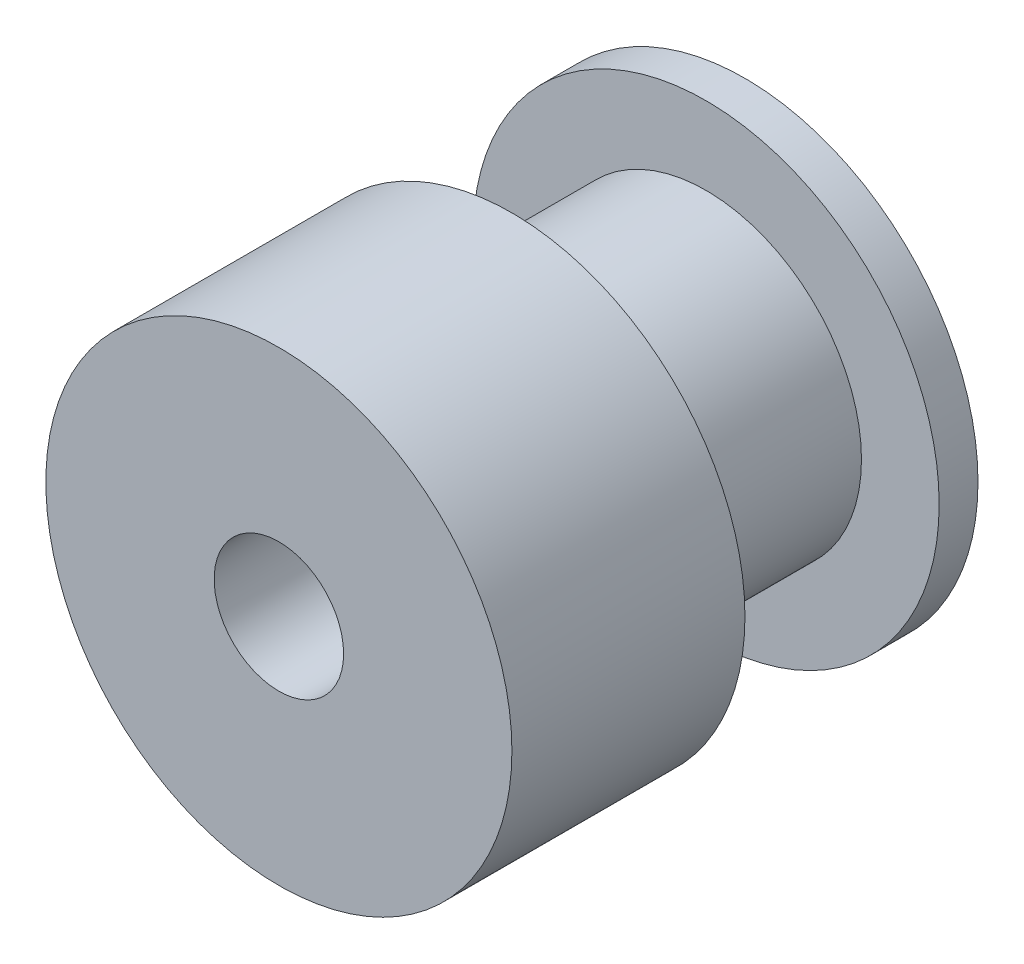
ISO-10303-21;
HEADER;
FILE_DESCRIPTION(('STEP AP214'),'2;1');
FILE_NAME('part.step','',(''),(''),'','','');
FILE_SCHEMA(('AUTOMOTIVE_DESIGN { 1 0 10303 214 1 1 1 1 }'));
ENDSEC;
DATA;
#1=APPLICATION_CONTEXT('core data for automotive mechanical design processes');
#2=APPLICATION_PROTOCOL_DEFINITION('international standard','automotive_design',2000,#1);
#3=PRODUCT_CONTEXT('',#1,'mechanical');
#4=PRODUCT('Part','Part','',(#3));
#5=PRODUCT_RELATED_PRODUCT_CATEGORY('part','',(#4));
#6=PRODUCT_DEFINITION_FORMATION('','',#4);
#7=PRODUCT_DEFINITION_CONTEXT('part definition',#1,'design');
#8=PRODUCT_DEFINITION('design','',#6,#7);
#9=PRODUCT_DEFINITION_SHAPE('','',#8);
#10=(LENGTH_UNIT() NAMED_UNIT(*) SI_UNIT(.MILLI.,.METRE.));
#11=(NAMED_UNIT(*) PLANE_ANGLE_UNIT() SI_UNIT($,.RADIAN.));
#12=(NAMED_UNIT(*) SI_UNIT($,.STERADIAN.) SOLID_ANGLE_UNIT());
#13=UNCERTAINTY_MEASURE_WITH_UNIT(LENGTH_MEASURE(1.E-05),#10,'distance_accuracy_value','');
#14=(GEOMETRIC_REPRESENTATION_CONTEXT(3) GLOBAL_UNCERTAINTY_ASSIGNED_CONTEXT((#13)) GLOBAL_UNIT_ASSIGNED_CONTEXT((#10,
#11,#12)) REPRESENTATION_CONTEXT('',''));
#15=CARTESIAN_POINT('',(0.,0.,0.));
#16=DIRECTION('',(0.,0.,1.));
#17=DIRECTION('',(1.,0.,0.));
#18=AXIS2_PLACEMENT_3D('',#15,#16,#17);
#19=CARTESIAN_POINT('',(0.,0.,18.));
#20=DIRECTION('',(0.,0.,-1.));
#21=DIRECTION('',(-1.,0.,0.));
#22=AXIS2_PLACEMENT_3D('',#19,#20,#21);
#23=CYLINDRICAL_SURFACE('',#22,9.);
#24=CARTESIAN_POINT('',(-9.,0.,14.75));
#25=CARTESIAN_POINT('',(-8.99999894112753,-0.0698524432674793,14.7499970764134));
#26=CARTESIAN_POINT('',(-8.9991782190975,-0.139746876410525,14.7441250072102));
#27=CARTESIAN_POINT('',(-8.99598316286198,-0.277586159937056,14.7207955090503));
#28=CARTESIAN_POINT('',(-8.99360726484073,-0.345528975998051,14.7033264183935));
#29=CARTESIAN_POINT('',(-8.98756916249447,-0.477449936054394,14.6573314803886));
#30=CARTESIAN_POINT('',(-8.98390788118545,-0.541430886330462,14.6288135655305));
#31=CARTESIAN_POINT('',(-8.97570481006727,-0.663688186066636,14.5615489663612));
#32=CARTESIAN_POINT('',(-8.97116315591379,-0.721965412327885,14.5228038576146));
#33=CARTESIAN_POINT('',(-8.96167110812554,-0.831564576835303,14.4359061120719));
#34=CARTESIAN_POINT('',(-8.95671841784775,-0.882842518790509,14.38769823037));
#35=CARTESIAN_POINT('',(-8.94698072235377,-0.976608234008458,14.2833621808506));
#36=CARTESIAN_POINT('',(-8.94219572626413,-1.01909552946634,14.2272335827909));
#37=CARTESIAN_POINT('',(-8.93331280195876,-1.09424186139763,14.1083581044656));
#38=CARTESIAN_POINT('',(-8.92921783911827,-1.12685893577152,14.0455844573968));
#39=CARTESIAN_POINT('',(-8.9222095544648,-1.18107087638651,13.9153837950484));
#40=CARTESIAN_POINT('',(-8.91929617746777,-1.20266625739016,13.8479569972589));
#41=CARTESIAN_POINT('',(-8.91500325152303,-1.23408646989723,13.7108241341288));
#42=CARTESIAN_POINT('',(-8.91361394942638,-1.24398617833557,13.6411355355509));
#43=CARTESIAN_POINT('',(-8.91249677033616,-1.25196586814035,13.5010734013625));
#44=CARTESIAN_POINT('',(-8.91276881133565,-1.25004643292126,13.4306998997312));
#45=CARTESIAN_POINT('',(-8.91493465758728,-1.23450363802965,13.2917912089734));
#46=CARTESIAN_POINT('',(-8.91681696642588,-1.22096324330852,13.2232465318094));
#47=CARTESIAN_POINT('',(-8.92197331658116,-1.18269256535987,13.0894116656842));
#48=CARTESIAN_POINT('',(-8.92524739209301,-1.15796200719349,13.0241215567304));
#49=CARTESIAN_POINT('',(-8.93283122971518,-1.09792538280569,12.8983942713472));
#50=CARTESIAN_POINT('',(-8.93714446505613,-1.0625837510599,12.8379742960476));
#51=CARTESIAN_POINT('',(-8.94631804418279,-0.982353578958003,12.723891038365));
#52=CARTESIAN_POINT('',(-8.95117841880647,-0.937464500359761,12.6702281371873));
#53=CARTESIAN_POINT('',(-8.96094958209836,-0.838956215124414,12.570701144593));
#54=CARTESIAN_POINT('',(-8.96586044627415,-0.785265592189274,12.5249077163315));
#55=CARTESIAN_POINT('',(-8.97514050674014,-0.670922859167218,12.4429714225639));
#56=CARTESIAN_POINT('',(-8.97950970122931,-0.610270725934937,12.4068285891451));
#57=CARTESIAN_POINT('',(-8.98721779212188,-0.48366856673251,12.3452174912496));
#58=CARTESIAN_POINT('',(-8.99055620841331,-0.417716089958269,12.3197541990764));
#59=CARTESIAN_POINT('',(-8.99582244302654,-0.282414617975524,12.280283927917));
#60=CARTESIAN_POINT('',(-8.99775034299602,-0.213065819610928,12.2662762858154));
#61=CARTESIAN_POINT('',(-8.99996760516493,-0.0735506507378779,12.2502077928597));
#62=CARTESIAN_POINT('',(-9.00027030327137,-0.00339568328216565,12.2480497048746));
#63=CARTESIAN_POINT('',(-8.99923922007978,0.136275022554033,12.2554841765477));
#64=CARTESIAN_POINT('',(-8.99790548202965,0.205790777778776,12.2650764256667));
#65=CARTESIAN_POINT('',(-8.99375965195284,0.341918779308823,12.2956584556032));
#66=CARTESIAN_POINT('',(-8.99095364519698,0.408541763946739,12.3166013329707));
#67=CARTESIAN_POINT('',(-8.98417711217329,0.537330456139149,12.3692409923423));
#68=CARTESIAN_POINT('',(-8.98020653811878,0.599495980656597,12.4009382156469));
#69=CARTESIAN_POINT('',(-8.97150954082181,0.718035810499835,12.4744182445134));
#70=CARTESIAN_POINT('',(-8.96677851553782,0.774371184438115,12.516263300766));
#71=CARTESIAN_POINT('',(-8.95710284930005,0.879254172769037,12.6087638519514));
#72=CARTESIAN_POINT('',(-8.95215819779384,0.927801401893363,12.6594197824873));
#73=CARTESIAN_POINT('',(-8.94257081023238,1.0160797430412,12.7685349467284));
#74=CARTESIAN_POINT('',(-8.93793045954481,1.05574600476852,12.8270468876433));
#75=CARTESIAN_POINT('',(-8.92951793446703,1.12468695508694,12.9499600185109));
#76=CARTESIAN_POINT('',(-8.92574573934466,1.15396189183909,13.0143610677763));
#77=CARTESIAN_POINT('',(-8.91951345452543,1.20118657145917,13.1470235457848));
#78=CARTESIAN_POINT('',(-8.91704928346967,1.2191715741733,13.2152722227998));
#79=CARTESIAN_POINT('',(-8.91370081228885,1.24341873550693,13.3538577657775));
#80=CARTESIAN_POINT('',(-8.91281641984846,1.24968157911898,13.4241945094785));
#81=CARTESIAN_POINT('',(-8.91273074448821,1.25029208082021,13.5643138114601));
#82=CARTESIAN_POINT('',(-8.91351506465158,1.2447416584131,13.6340959385059));
#83=CARTESIAN_POINT('',(-8.91664731052215,1.22210038835409,13.7717246084148));
#84=CARTESIAN_POINT('',(-8.91899523506782,1.20500954927507,13.8395711527156));
#85=CARTESIAN_POINT('',(-8.92498537468198,1.15980672337383,13.9713813721868));
#86=CARTESIAN_POINT('',(-8.92862687318732,1.13170083734511,14.0353471741365));
#87=CARTESIAN_POINT('',(-8.93679486162302,1.06527577701554,14.1576715834595));
#88=CARTESIAN_POINT('',(-8.94132137280736,1.02695635742407,14.2160300561201));
#89=CARTESIAN_POINT('',(-8.95079601194598,0.94081790057283,14.3260026282592));
#90=CARTESIAN_POINT('',(-8.9557473092005,0.892923123926596,14.3775571357939));
#91=CARTESIAN_POINT('',(-8.9654864535163,0.789153098909232,14.4719345729145));
#92=CARTESIAN_POINT('',(-8.97027426208699,0.733275987068046,14.5147554579602));
#93=CARTESIAN_POINT('',(-8.97917230387635,0.614821941865005,14.5906262405455));
#94=CARTESIAN_POINT('',(-8.98327925254998,0.552214803422004,14.6236293504997));
#95=CARTESIAN_POINT('',(-8.99032025416553,0.422321399113689,14.6786041751453));
#96=CARTESIAN_POINT('',(-8.99325554918744,0.355040177626123,14.7005875782822));
#97=CARTESIAN_POINT('',(-8.99693485713489,0.239529012760908,14.727782701193));
#98=CARTESIAN_POINT('',(-8.99807852526027,0.192019668179786,14.7361018139969));
#99=CARTESIAN_POINT('',(-8.9996114581541,0.0963468711203362,14.7472114443363));
#100=CARTESIAN_POINT('',(-9.00000073039825,0.0481834251286111,14.7500020166569));
#101=CARTESIAN_POINT('',(-9.,0.,14.75));
#102=B_SPLINE_CURVE_WITH_KNOTS('',3,(#24,#25,#26,#27,#28,#29,#30,#31,#32,#33,#34,#35,#36,#37,
#38,#39,#40,#41,#42,#43,#44,#45,#46,#47,#48,#49,#50,#51,#52,#53,#54,#55,#56,#57,#58,#59,#60,#61,
#62,#63,#64,#65,#66,#67,#68,#69,#70,#71,#72,#73,#74,#75,#76,#77,#78,#79,#80,#81,#82,#83,#84,#85,
#86,#87,#88,#89,#90,#91,#92,#93,#94,#95,#96,#97,#98,#99,#100,#101),.UNSPECIFIED.,.T.,.F.,(4,2,2,
2,2,2,2,2,2,2,2,2,2,2,2,2,2,2,2,2,2,2,2,2,2,2,2,2,2,2,2,2,2,2,2,2,2,2,4),(0.,0.209381295059176,
0.418973458745449,0.628415424004149,0.83782514220054,1.0484958752077,1.25917805595891,
1.47074373528117,1.68229953263234,1.89249345858177,2.10267700905927,2.31137237127791,
2.52007286135607,2.72948082119297,2.93890058963983,3.15011234914945,3.36132481090823,
3.57263550251899,3.78393396145113,3.99349589004417,4.20305228043053,4.41174926456981,
4.62045481354833,4.83047455215844,5.04050467694124,5.25202178604051,5.46353384344125,
5.67438199262967,5.8852178203746,6.09424202940506,6.30326608316047,6.51217453009901,
6.72108799468396,6.93172442182197,7.14241010247462,7.35408430824961,7.5655335166086,
7.70996379646391,7.85439264507531),.UNSPECIFIED.);
#103=CARTESIAN_POINT('',(-9.,0.,14.75));
#104=VERTEX_POINT('',#103);
#105=EDGE_CURVE('E65',#104,#104,#102,.T.);
#106=ORIENTED_EDGE('',*,*,#105,.T.);
#107=EDGE_LOOP('',(#106));
#108=FACE_BOUND('',#107,.T.);
#109=CARTESIAN_POINT('',(0.,-9.,14.75));
#110=CARTESIAN_POINT('',(0.0698524432674794,-8.99999894112753,14.7499970764134));
#111=CARTESIAN_POINT('',(0.139746876410526,-8.9991782190975,14.7441250072102));
#112=CARTESIAN_POINT('',(0.277586159937057,-8.99598316286198,14.7207955090503));
#113=CARTESIAN_POINT('',(0.345528975998052,-8.99360726484073,14.7033264183935));
#114=CARTESIAN_POINT('',(0.477449936054396,-8.98756916249447,14.6573314803886));
#115=CARTESIAN_POINT('',(0.541430886330464,-8.98390788118545,14.6288135655306));
#116=CARTESIAN_POINT('',(0.66368818606664,-8.97570481006727,14.5615489663612));
#117=CARTESIAN_POINT('',(0.721965412327891,-8.97116315591379,14.5228038576146));
#118=CARTESIAN_POINT('',(0.831564576835312,-8.96167110812553,14.435906112072));
#119=CARTESIAN_POINT('',(0.88284251879052,-8.95671841784775,14.3876982303701));
#120=CARTESIAN_POINT('',(0.976608234008471,-8.94698072235377,14.2833621808506));
#121=CARTESIAN_POINT('',(1.01909552946636,-8.94219572626413,14.227233582791));
#122=CARTESIAN_POINT('',(1.09424186139764,-8.93331280195876,14.1083581044657));
#123=CARTESIAN_POINT('',(1.12685893577153,-8.92921783911827,14.0455844573968));
#124=CARTESIAN_POINT('',(1.18107087638653,-8.9222095544648,13.9153837950484));
#125=CARTESIAN_POINT('',(1.20266625739018,-8.91929617746777,13.847956997259));
#126=CARTESIAN_POINT('',(1.23408646989725,-8.91500325152303,13.7108241341288));
#127=CARTESIAN_POINT('',(1.24398617833559,-8.91361394942638,13.641135535551));
#128=CARTESIAN_POINT('',(1.25196586814038,-8.91249677033615,13.5010734013625));
#129=CARTESIAN_POINT('',(1.25004643292129,-8.91276881133565,13.4306998997312));
#130=CARTESIAN_POINT('',(1.23450363802969,-8.91493465758728,13.2917912089735));
#131=CARTESIAN_POINT('',(1.22096324330855,-8.91681696642587,13.2232465318095));
#132=CARTESIAN_POINT('',(1.18269256535992,-8.92197331658116,13.0894116656842));
#133=CARTESIAN_POINT('',(1.15796200719353,-8.92524739209301,13.0241215567304));
#134=CARTESIAN_POINT('',(1.09792538280573,-8.93283122971518,12.8983942713472));
#135=CARTESIAN_POINT('',(1.06258375105995,-8.93714446505613,12.8379742960476));
#136=CARTESIAN_POINT('',(0.982353578958055,-8.94631804418278,12.7238910383651));
#137=CARTESIAN_POINT('',(0.937464500359815,-8.95117841880646,12.6702281371873));
#138=CARTESIAN_POINT('',(0.83895621512447,-8.96094958209835,12.570701144593));
#139=CARTESIAN_POINT('',(0.785265592189331,-8.96586044627415,12.5249077163315));
#140=CARTESIAN_POINT('',(0.670922859167277,-8.97514050674014,12.4429714225639));
#141=CARTESIAN_POINT('',(0.610270725934997,-8.97950970122931,12.4068285891452));
#142=CARTESIAN_POINT('',(0.483668566732571,-8.98721779212188,12.3452174912496));
#143=CARTESIAN_POINT('',(0.417716089958331,-8.99055620841331,12.3197541990765));
#144=CARTESIAN_POINT('',(0.282414617975588,-8.99582244302653,12.280283927917));
#145=CARTESIAN_POINT('',(0.213065819610992,-8.99775034299601,12.2662762858154));
#146=CARTESIAN_POINT('',(0.0735506507379419,-8.99996760516492,12.2502077928597));
#147=CARTESIAN_POINT('',(0.00339568328222966,-9.00027030327137,12.2480497048746));
#148=CARTESIAN_POINT('',(-0.13627502255397,-8.99923922007978,12.2554841765477));
#149=CARTESIAN_POINT('',(-0.205790777778713,-8.99790548202965,12.2650764256667));
#150=CARTESIAN_POINT('',(-0.341918779308761,-8.99375965195284,12.2956584556032));
#151=CARTESIAN_POINT('',(-0.408541763946677,-8.99095364519698,12.3166013329707));
#152=CARTESIAN_POINT('',(-0.537330456139089,-8.9841771121733,12.3692409923423));
#153=CARTESIAN_POINT('',(-0.599495980656538,-8.98020653811879,12.4009382156469));
#154=CARTESIAN_POINT('',(-0.718035810499777,-8.97150954082181,12.4744182445134));
#155=CARTESIAN_POINT('',(-0.774371184438058,-8.96677851553782,12.516263300766));
#156=CARTESIAN_POINT('',(-0.879254172768982,-8.95710284930006,12.6087638519514));
#157=CARTESIAN_POINT('',(-0.927801401893309,-8.95215819779385,12.6594197824873));
#158=CARTESIAN_POINT('',(-1.01607974304115,-8.94257081023239,12.7685349467284));
#159=CARTESIAN_POINT('',(-1.05574600476847,-8.93793045954482,12.8270468876433));
#160=CARTESIAN_POINT('',(-1.12468695508689,-8.92951793446703,12.9499600185109));
#161=CARTESIAN_POINT('',(-1.15396189183904,-8.92574573934466,13.0143610677762));
#162=CARTESIAN_POINT('',(-1.20118657145913,-8.91951345452543,13.1470235457847));
#163=CARTESIAN_POINT('',(-1.21917157417326,-8.91704928346968,13.2152722227997));
#164=CARTESIAN_POINT('',(-1.24341873550689,-8.91370081228886,13.3538577657774));
#165=CARTESIAN_POINT('',(-1.24968157911894,-8.91281641984846,13.4241945094785));
#166=CARTESIAN_POINT('',(-1.25029208082018,-8.91273074448822,13.56431381146));
#167=CARTESIAN_POINT('',(-1.24474165841307,-8.91351506465158,13.6340959385059));
#168=CARTESIAN_POINT('',(-1.22210038835406,-8.91664731052215,13.7717246084147));
#169=CARTESIAN_POINT('',(-1.20500954927505,-8.91899523506783,13.8395711527156));
#170=CARTESIAN_POINT('',(-1.15980672337381,-8.92498537468198,13.9713813721868));
#171=CARTESIAN_POINT('',(-1.13170083734509,-8.92862687318733,14.0353471741365));
#172=CARTESIAN_POINT('',(-1.06527577701553,-8.93679486162302,14.1576715834595));
#173=CARTESIAN_POINT('',(-1.02695635742406,-8.94132137280736,14.21603005612));
#174=CARTESIAN_POINT('',(-0.94081790057282,-8.95079601194598,14.3260026282592));
#175=CARTESIAN_POINT('',(-0.892923123926587,-8.9557473092005,14.3775571357939));
#176=CARTESIAN_POINT('',(-0.789153098909225,-8.9654864535163,14.4719345729145));
#177=CARTESIAN_POINT('',(-0.733275987068041,-8.97027426208699,14.5147554579602));
#178=CARTESIAN_POINT('',(-0.614821941865002,-8.97917230387635,14.5906262405455));
#179=CARTESIAN_POINT('',(-0.552214803422002,-8.98327925254998,14.6236293504997));
#180=CARTESIAN_POINT('',(-0.422321399113688,-8.99032025416553,14.6786041751453));
#181=CARTESIAN_POINT('',(-0.355040177626122,-8.99325554918744,14.7005875782822));
#182=CARTESIAN_POINT('',(-0.239529012760908,-8.99693485713489,14.727782701193));
#183=CARTESIAN_POINT('',(-0.192019668179786,-8.99807852526027,14.7361018139969));
#184=CARTESIAN_POINT('',(-0.0963468711203365,-8.9996114581541,14.7472114443363));
#185=CARTESIAN_POINT('',(-0.0481834251286112,-9.00000073039825,14.7500020166569));
#186=CARTESIAN_POINT('',(0.,-9.,14.75));
#187=B_SPLINE_CURVE_WITH_KNOTS('',3,(#109,#110,#111,#112,#113,#114,#115,#116,#117,#118,#119,
#120,#121,#122,#123,#124,#125,#126,#127,#128,#129,#130,#131,#132,#133,#134,#135,#136,#137,#138,
#139,#140,#141,#142,#143,#144,#145,#146,#147,#148,#149,#150,#151,#152,#153,#154,#155,#156,#157,
#158,#159,#160,#161,#162,#163,#164,#165,#166,#167,#168,#169,#170,#171,#172,#173,#174,#175,#176,
#177,#178,#179,#180,#181,#182,#183,#184,#185,#186),.UNSPECIFIED.,.T.,.F.,(4,2,2,2,2,2,2,2,2,2,2,
2,2,2,2,2,2,2,2,2,2,2,2,2,2,2,2,2,2,2,2,2,2,2,2,2,2,2,4),(0.,0.209381295059176,
0.418973458745448,0.628415424004147,0.83782514220054,1.0484958752077,1.25917805595891,
1.47074373528117,1.68229953263234,1.89249345858177,2.10267700905927,2.31137237127791,
2.52007286135607,2.72948082119297,2.93890058963983,3.15011234914945,3.36132481090823,
3.57263550251899,3.78393396145114,3.99349589004417,4.20305228043053,4.41174926456981,
4.62045481354833,4.83047455215844,5.04050467694123,5.25202178604051,5.46353384344125,
5.67438199262967,5.88521782037459,6.09424202940506,6.30326608316047,6.51217453009901,
6.72108799468396,6.93172442182198,7.14241010247462,7.35408430824961,7.5655335166086,
7.70996379646391,7.85439264507531),.UNSPECIFIED.);
#188=CARTESIAN_POINT('',(0.,-9.,14.75));
#189=VERTEX_POINT('',#188);
#190=EDGE_CURVE('E64',#189,#189,#187,.T.);
#191=ORIENTED_EDGE('',*,*,#190,.T.);
#192=EDGE_LOOP('',(#191));
#193=FACE_BOUND('',#192,.T.);
#194=CARTESIAN_POINT('',(0.,0.,9.));
#195=DIRECTION('',(0.,0.,1.));
#196=DIRECTION('',(1.,0.,0.));
#197=AXIS2_PLACEMENT_3D('',#194,#195,#196);
#198=CIRCLE('',#197,9.);
#199=CARTESIAN_POINT('',(9.,0.,9.));
#200=VERTEX_POINT('',#199);
#201=EDGE_CURVE('E53',#200,#200,#198,.T.);
#202=ORIENTED_EDGE('',*,*,#201,.T.);
#203=EDGE_LOOP('',(#202));
#204=FACE_BOUND('',#203,.T.);
#205=CARTESIAN_POINT('',(0.,0.,18.));
#206=DIRECTION('',(0.,0.,1.));
#207=DIRECTION('',(1.,0.,0.));
#208=AXIS2_PLACEMENT_3D('',#205,#206,#207);
#209=CIRCLE('',#208,9.);
#210=CARTESIAN_POINT('',(9.,0.,18.));
#211=VERTEX_POINT('',#210);
#212=EDGE_CURVE('E10',#211,#211,#209,.T.);
#213=ORIENTED_EDGE('',*,*,#212,.F.);
#214=EDGE_LOOP('',(#213));
#215=FACE_BOUND('',#214,.T.);
#216=ADVANCED_FACE('F35',(#108,#193,#204,#215),#23,.T.);
#217=CARTESIAN_POINT('',(0.,0.,18.));
#218=DIRECTION('',(0.,0.,1.));
#219=DIRECTION('',(1.,0.,0.));
#220=AXIS2_PLACEMENT_3D('',#217,#218,#219);
#221=PLANE('',#220);
#222=CARTESIAN_POINT('',(0.,0.,18.));
#223=DIRECTION('',(0.,0.,1.));
#224=DIRECTION('',(1.,0.,0.));
#225=AXIS2_PLACEMENT_3D('',#222,#223,#224);
#226=CIRCLE('',#225,2.5);
#227=CARTESIAN_POINT('',(2.5,0.,18.));
#228=VERTEX_POINT('',#227);
#229=EDGE_CURVE('E87',#228,#228,#226,.T.);
#230=ORIENTED_EDGE('',*,*,#229,.F.);
#231=EDGE_LOOP('',(#230));
#232=FACE_BOUND('',#231,.T.);
#233=ORIENTED_EDGE('',*,*,#212,.T.);
#234=EDGE_LOOP('',(#233));
#235=FACE_BOUND('',#234,.T.);
#236=ADVANCED_FACE('F118',(#232,#235),#221,.T.);
#237=CARTESIAN_POINT('',(0.,0.,9.));
#238=DIRECTION('',(0.,0.,1.));
#239=DIRECTION('',(1.,0.,0.));
#240=AXIS2_PLACEMENT_3D('',#237,#238,#239);
#241=PLANE('',#240);
#242=ORIENTED_EDGE('',*,*,#201,.F.);
#243=EDGE_LOOP('',(#242));
#244=FACE_BOUND('',#243,.T.);
#245=CARTESIAN_POINT('',(0.,0.,9.));
#246=DIRECTION('',(0.,0.,1.));
#247=DIRECTION('',(1.,0.,0.));
#248=AXIS2_PLACEMENT_3D('',#245,#246,#247);
#249=CIRCLE('',#248,6.);
#250=CARTESIAN_POINT('',(6.,0.,9.));
#251=VERTEX_POINT('',#250);
#252=EDGE_CURVE('E93',#251,#251,#249,.T.);
#253=ORIENTED_EDGE('',*,*,#252,.T.);
#254=EDGE_LOOP('',(#253));
#255=FACE_BOUND('',#254,.T.);
#256=ADVANCED_FACE('F123',(#244,#255),#241,.F.);
#257=CARTESIAN_POINT('',(0.,0.,1.5));
#258=DIRECTION('',(0.,0.,1.));
#259=DIRECTION('',(1.,0.,0.));
#260=AXIS2_PLACEMENT_3D('',#257,#258,#259);
#261=PLANE('',#260);
#262=CARTESIAN_POINT('',(0.,0.,1.5));
#263=DIRECTION('',(0.,0.,1.));
#264=DIRECTION('',(1.,0.,0.));
#265=AXIS2_PLACEMENT_3D('',#262,#263,#264);
#266=CIRCLE('',#265,9.);
#267=CARTESIAN_POINT('',(9.,0.,1.5));
#268=VERTEX_POINT('',#267);
#269=EDGE_CURVE('E56',#268,#268,#266,.T.);
#270=ORIENTED_EDGE('',*,*,#269,.T.);
#271=EDGE_LOOP('',(#270));
#272=FACE_BOUND('',#271,.T.);
#273=CARTESIAN_POINT('',(0.,0.,1.5));
#274=DIRECTION('',(0.,0.,1.));
#275=DIRECTION('',(1.,0.,0.));
#276=AXIS2_PLACEMENT_3D('',#273,#274,#275);
#277=CIRCLE('',#276,6.);
#278=CARTESIAN_POINT('',(6.,0.,1.5));
#279=VERTEX_POINT('',#278);
#280=EDGE_CURVE('E90',#279,#279,#277,.T.);
#281=ORIENTED_EDGE('',*,*,#280,.F.);
#282=EDGE_LOOP('',(#281));
#283=FACE_BOUND('',#282,.T.);
#284=ADVANCED_FACE('F103',(#272,#283),#261,.T.);
#285=CARTESIAN_POINT('',(0.,0.,9.));
#286=DIRECTION('',(0.,0.,-1.));
#287=DIRECTION('',(-1.,0.,0.));
#288=AXIS2_PLACEMENT_3D('',#285,#286,#287);
#289=CYLINDRICAL_SURFACE('',#288,6.);
#290=ORIENTED_EDGE('',*,*,#252,.F.);
#291=EDGE_LOOP('',(#290));
#292=FACE_BOUND('',#291,.T.);
#293=ORIENTED_EDGE('',*,*,#280,.T.);
#294=EDGE_LOOP('',(#293));
#295=FACE_BOUND('',#294,.T.);
#296=ADVANCED_FACE('F115',(#292,#295),#289,.T.);
#297=CARTESIAN_POINT('',(0.,0.,0.));
#298=DIRECTION('',(0.,0.,1.));
#299=DIRECTION('',(1.,0.,0.));
#300=AXIS2_PLACEMENT_3D('',#297,#298,#299);
#301=PLANE('',#300);
#302=CARTESIAN_POINT('',(0.,0.,0.));
#303=DIRECTION('',(0.,0.,1.));
#304=DIRECTION('',(1.,0.,0.));
#305=AXIS2_PLACEMENT_3D('',#302,#303,#304);
#306=CIRCLE('',#305,2.5);
#307=CARTESIAN_POINT('',(2.5,0.,0.));
#308=VERTEX_POINT('',#307);
#309=EDGE_CURVE('E83',#308,#308,#306,.T.);
#310=ORIENTED_EDGE('',*,*,#309,.T.);
#311=EDGE_LOOP('',(#310));
#312=FACE_BOUND('',#311,.T.);
#313=CARTESIAN_POINT('',(0.,0.,0.));
#314=DIRECTION('',(0.,0.,1.));
#315=DIRECTION('',(1.,0.,0.));
#316=AXIS2_PLACEMENT_3D('',#313,#314,#315);
#317=CIRCLE('',#316,9.);
#318=CARTESIAN_POINT('',(9.,0.,0.));
#319=VERTEX_POINT('',#318);
#320=EDGE_CURVE('E48',#319,#319,#317,.T.);
#321=ORIENTED_EDGE('',*,*,#320,.F.);
#322=EDGE_LOOP('',(#321));
#323=FACE_BOUND('',#322,.T.);
#324=ADVANCED_FACE('F108',(#312,#323),#301,.F.);
#325=ORIENTED_EDGE('',*,*,#320,.T.);
#326=EDGE_LOOP('',(#325));
#327=FACE_BOUND('',#326,.T.);
#328=ORIENTED_EDGE('',*,*,#269,.F.);
#329=EDGE_LOOP('',(#328));
#330=FACE_BOUND('',#329,.T.);
#331=ADVANCED_FACE('F106',(#327,#330),#23,.T.);
#332=CARTESIAN_POINT('',(0.,0.,18.));
#333=DIRECTION('',(0.,0.,-1.));
#334=DIRECTION('',(-1.,0.,0.));
#335=AXIS2_PLACEMENT_3D('',#332,#333,#334);
#336=CYLINDRICAL_SURFACE('',#335,2.5);
#337=CARTESIAN_POINT('',(-2.5,0.,14.75));
#338=CARTESIAN_POINT('',(-2.49999641755189,-0.0657149536912332,14.7499958721006));
#339=CARTESIAN_POINT('',(-2.49738113774397,-0.131508249622541,14.7447874085979));
#340=CARTESIAN_POINT('',(-2.48717695046745,-0.261150294085532,14.7241838995739));
#341=CARTESIAN_POINT('',(-2.47957859786229,-0.32499510839188,14.7087695087529));
#342=CARTESIAN_POINT('',(-2.46020349254139,-0.448666931100718,14.668507739229));
#343=CARTESIAN_POINT('',(-2.448442989719,-0.508508503673975,14.64369701969));
#344=CARTESIAN_POINT('',(-2.42182220644723,-0.623090771008206,14.5855367232938));
#345=CARTESIAN_POINT('',(-2.40696217041913,-0.677831867487562,14.5521878196889));
#346=CARTESIAN_POINT('',(-2.37445322822571,-0.784384772202399,14.4756034381434));
#347=CARTESIAN_POINT('',(-2.3566899890942,-0.83581901390264,14.4318919009504));
#348=CARTESIAN_POINT('',(-2.3207496280843,-0.930974306083721,14.3368481509412));
#349=CARTESIAN_POINT('',(-2.30257220261294,-0.974689478883457,14.2855101852844));
#350=CARTESIAN_POINT('',(-2.26623688996684,-1.05656500056285,14.1718958130958));
#351=CARTESIAN_POINT('',(-2.24818983712665,-1.09403166943955,14.1090798770676));
#352=CARTESIAN_POINT('',(-2.21607473465401,-1.15771028361337,13.9770408300172));
#353=CARTESIAN_POINT('',(-2.20200384508737,-1.18393026870791,13.9078223390966));
#354=CARTESIAN_POINT('',(-2.18072333797261,-1.22266555273573,13.7691686182226));
#355=CARTESIAN_POINT('',(-2.17315339479642,-1.23590732135055,13.6999944349157));
#356=CARTESIAN_POINT('',(-2.1647736243566,-1.25053374163605,13.5600264527756));
#357=CARTESIAN_POINT('',(-2.1639571167911,-1.25193011046634,13.489234323911));
#358=CARTESIAN_POINT('',(-2.16888662821561,-1.24335910896536,13.3571424696058));
#359=CARTESIAN_POINT('',(-2.17385954577517,-1.23473069942102,13.2957199609712));
#360=CARTESIAN_POINT('',(-2.18845285917313,-1.20867481132116,13.1753476132837));
#361=CARTESIAN_POINT('',(-2.19807473539721,-1.19124452987206,13.1163985683683));
#362=CARTESIAN_POINT('',(-2.22109345515927,-1.14776222548249,13.0009635842929));
#363=CARTESIAN_POINT('',(-2.23457300829999,-1.12151883389498,12.9445670015178));
#364=CARTESIAN_POINT('',(-2.26379255351755,-1.06130210958499,12.8367071342625));
#365=CARTESIAN_POINT('',(-2.27953355975239,-1.02732530476557,12.7852460804999));
#366=CARTESIAN_POINT('',(-2.31391447379108,-0.947582568640972,12.681848434071));
#367=CARTESIAN_POINT('',(-2.33266887795933,-0.900868072961588,12.6306789080298));
#368=CARTESIAN_POINT('',(-2.3693452912551,-0.799444473426701,12.5365807267614));
#369=CARTESIAN_POINT('',(-2.38726689948502,-0.74473157071784,12.4936560099576));
#370=CARTESIAN_POINT('',(-2.42127484103705,-0.625645632289793,12.4153929237128));
#371=CARTESIAN_POINT('',(-2.4372373020251,-0.560941989499243,12.3804994094428));
#372=CARTESIAN_POINT('',(-2.46447351401553,-0.425582769360977,12.3223787136962));
#373=CARTESIAN_POINT('',(-2.47575098679441,-0.354931970331577,12.299142268731));
#374=CARTESIAN_POINT('',(-2.49155417176795,-0.215958114575858,12.2669057453541));
#375=CARTESIAN_POINT('',(-2.4965617287664,-0.147926913185386,12.2568859553165));
#376=CARTESIAN_POINT('',(-2.50091266823877,-0.0109744999366733,12.2481690860819));
#377=CARTESIAN_POINT('',(-2.5002587340164,0.0579462748373953,12.2494666429506));
#378=CARTESIAN_POINT('',(-2.49363990316801,0.18904121498251,12.2627583605234));
#379=CARTESIAN_POINT('',(-2.48809057110237,0.251324260062461,12.2739156659125));
#380=CARTESIAN_POINT('',(-2.47277714143523,0.373008615377414,12.3052975898689));
#381=CARTESIAN_POINT('',(-2.46301257917915,0.432409607113764,12.3255232080667));
#382=CARTESIAN_POINT('',(-2.43980314267086,0.548610760562099,12.3749980830415));
#383=CARTESIAN_POINT('',(-2.42626102212424,0.605287996257709,12.404488812646));
#384=CARTESIAN_POINT('',(-2.39679967896386,0.713076702123668,12.4713844195576));
#385=CARTESIAN_POINT('',(-2.38087944457231,0.764185787219119,12.5087926682418));
#386=CARTESIAN_POINT('',(-2.3463527667183,0.864709611613333,12.5947005316661));
#387=CARTESIAN_POINT('',(-2.32763606060551,0.913465097280816,12.643928585567));
#388=CARTESIAN_POINT('',(-2.29077989504842,1.00232040139157,12.7499064390866));
#389=CARTESIAN_POINT('',(-2.27264084226907,1.04241423211357,12.8066613985205));
#390=CARTESIAN_POINT('',(-2.23813990282584,1.11463489312213,12.9295545677504));
#391=CARTESIAN_POINT('',(-2.22190662079339,1.14628186984831,12.9960140827608));
#392=CARTESIAN_POINT('',(-2.19467590460157,1.19760353251727,13.1343875846157));
#393=CARTESIAN_POINT('',(-2.18367172800772,1.21729364485947,13.2062944081265));
#394=CARTESIAN_POINT('',(-2.16951876260833,1.24232710931211,13.3461377785768));
#395=CARTESIAN_POINT('',(-2.16571729325613,1.24886624550109,13.4137928167863));
#396=CARTESIAN_POINT('',(-2.16456693307718,1.25086144297599,13.5493088339634));
#397=CARTESIAN_POINT('',(-2.1672152453444,1.24632230828051,13.6171697109243));
#398=CARTESIAN_POINT('',(-2.17797327562531,1.22740765699034,13.744354376915));
#399=CARTESIAN_POINT('',(-2.18553868102992,1.21401039292851,13.8038755876805));
#400=CARTESIAN_POINT('',(-2.20463770234897,1.17896919778081,13.9197601492809));
#401=CARTESIAN_POINT('',(-2.21617259462094,1.15732261394977,13.976122477615));
#402=CARTESIAN_POINT('',(-2.2428566295566,1.10476968162586,14.0882810637333));
#403=CARTESIAN_POINT('',(-2.25819652995238,1.07333892227058,14.1437848772871));
#404=CARTESIAN_POINT('',(-2.29044164543238,1.0026887145458,14.2490931702257));
#405=CARTESIAN_POINT('',(-2.30734767243152,0.963465214048314,14.2988946631481));
#406=CARTESIAN_POINT('',(-2.34327903949141,0.872754158330804,14.397677477947));
#407=CARTESIAN_POINT('',(-2.36231229139336,0.820355528762716,14.4458238779524));
#408=CARTESIAN_POINT('',(-2.3984719031886,0.70769350777535,14.5328287292795));
#409=CARTESIAN_POINT('',(-2.4155972326005,0.647425904070981,14.5716821742829));
#410=CARTESIAN_POINT('',(-2.44622511981379,0.519914496024933,14.6390454534528));
#411=CARTESIAN_POINT('',(-2.45970120703636,0.452624379918266,14.6674802117643));
#412=CARTESIAN_POINT('',(-2.48126676704332,0.313427626617737,14.7122602098987));
#413=CARTESIAN_POINT('',(-2.48937154216165,0.241534749528956,14.728639808537));
#414=CARTESIAN_POINT('',(-2.49619327387079,0.140752433104229,14.7423717638448));
#415=CARTESIAN_POINT('',(-2.49761706674002,0.112702349299373,14.7452283010795));
#416=CARTESIAN_POINT('',(-2.49952121222331,0.0564396647589468,14.749043331896));
#417=CARTESIAN_POINT('',(-2.50000153879704,0.0282270595592266,14.750001773089));
#418=CARTESIAN_POINT('',(-2.5,0.,14.75));
#419=B_SPLINE_CURVE_WITH_KNOTS('',3,(#337,#338,#339,#340,#341,#342,#343,#344,#345,#346,#347,
#348,#349,#350,#351,#352,#353,#354,#355,#356,#357,#358,#359,#360,#361,#362,#363,#364,#365,#366,
#367,#368,#369,#370,#371,#372,#373,#374,#375,#376,#377,#378,#379,#380,#381,#382,#383,#384,#385,
#386,#387,#388,#389,#390,#391,#392,#393,#394,#395,#396,#397,#398,#399,#400,#401,#402,#403,#404,
#405,#406,#407,#408,#409,#410,#411,#412,#413,#414,#415,#416,#417,#418),.UNSPECIFIED.,.T.,.F.,(4,
2,2,2,2,2,2,2,2,2,2,2,2,2,2,2,2,2,2,2,2,2,2,2,2,2,2,2,2,2,2,2,2,2,2,2,2,2,2,2,4),(0.,
0.197030321775366,0.394435187136498,0.591077694365374,0.787704700726961,0.996227198397614,
1.20490779706755,1.42977158038441,1.65447434872852,1.86572515175287,2.07676696661276,
2.26257140511651,2.44843504907098,2.6386280021061,2.82890651575278,3.04331176667349,
3.25781918248359,3.48228777768052,3.7065777114035,3.91229113089183,4.11790705639346,
4.30758633132653,4.49728652038665,4.69241070034874,4.88761813435425,5.10199513305524,
5.31651985769291,5.54143352699593,5.76605639925973,5.96911634372968,6.17208824825007,
6.35572412805229,6.53941910979598,6.73545570969518,6.93159451423698,7.15156553440624,
7.37165479220717,7.59330017078657,7.81431135781164,7.89894100172123,7.98357298143559),.UNSPECIFIED.);
#420=CARTESIAN_POINT('',(-2.5,0.,14.75));
#421=VERTEX_POINT('',#420);
#422=EDGE_CURVE('E39',#421,#421,#419,.T.);
#423=ORIENTED_EDGE('',*,*,#422,.F.);
#424=EDGE_LOOP('',(#423));
#425=FACE_BOUND('',#424,.T.);
#426=CARTESIAN_POINT('',(0.,-2.5,14.75));
#427=CARTESIAN_POINT('',(0.0657149536912332,-2.49999641755189,14.7499958721006));
#428=CARTESIAN_POINT('',(0.131508249622541,-2.49738113774397,14.7447874085979));
#429=CARTESIAN_POINT('',(0.261150294085532,-2.48717695046745,14.7241838995739));
#430=CARTESIAN_POINT('',(0.32499510839188,-2.47957859786229,14.7087695087529));
#431=CARTESIAN_POINT('',(0.448666931100718,-2.46020349254139,14.668507739229));
#432=CARTESIAN_POINT('',(0.508508503673975,-2.448442989719,14.64369701969));
#433=CARTESIAN_POINT('',(0.623090771008206,-2.42182220644723,14.5855367232938));
#434=CARTESIAN_POINT('',(0.677831867487563,-2.40696217041912,14.5521878196889));
#435=CARTESIAN_POINT('',(0.7843847722024,-2.37445322822571,14.4756034381434));
#436=CARTESIAN_POINT('',(0.835819013902642,-2.3566899890942,14.4318919009504));
#437=CARTESIAN_POINT('',(0.930974306083723,-2.3207496280843,14.3368481509412));
#438=CARTESIAN_POINT('',(0.97468947888346,-2.30257220261294,14.2855101852844));
#439=CARTESIAN_POINT('',(1.05656500056285,-2.26623688996684,14.1718958130958));
#440=CARTESIAN_POINT('',(1.09403166943955,-2.24818983712665,14.1090798770676));
#441=CARTESIAN_POINT('',(1.15771028361337,-2.21607473465401,13.9770408300172));
#442=CARTESIAN_POINT('',(1.18393026870792,-2.20200384508737,13.9078223390966));
#443=CARTESIAN_POINT('',(1.22266555273574,-2.18072333797261,13.7691686182226));
#444=CARTESIAN_POINT('',(1.23590732135055,-2.17315339479642,13.6999944349158));
#445=CARTESIAN_POINT('',(1.25053374163606,-2.1647736243566,13.5600264527757));
#446=CARTESIAN_POINT('',(1.25193011046634,-2.1639571167911,13.4892343239111));
#447=CARTESIAN_POINT('',(1.24335910896537,-2.1688866282156,13.3571424696058));
#448=CARTESIAN_POINT('',(1.23473069942103,-2.17385954577517,13.2957199609712));
#449=CARTESIAN_POINT('',(1.20867481132117,-2.18845285917313,13.1753476132837));
#450=CARTESIAN_POINT('',(1.19124452987207,-2.1980747353972,13.1163985683684));
#451=CARTESIAN_POINT('',(1.14776222548251,-2.22109345515926,13.0009635842929));
#452=CARTESIAN_POINT('',(1.12151883389499,-2.23457300829998,12.9445670015178));
#453=CARTESIAN_POINT('',(1.061302109585,-2.26379255351754,12.8367071342625));
#454=CARTESIAN_POINT('',(1.02732530476559,-2.27953355975238,12.7852460804999));
#455=CARTESIAN_POINT('',(0.947582568640987,-2.31391447379107,12.681848434071));
#456=CARTESIAN_POINT('',(0.900868072961604,-2.33266887795933,12.6306789080298));
#457=CARTESIAN_POINT('',(0.799444473426718,-2.36934529125509,12.5365807267614));
#458=CARTESIAN_POINT('',(0.744731570717858,-2.38726689948501,12.4936560099576));
#459=CARTESIAN_POINT('',(0.625645632289812,-2.42127484103705,12.4153929237128));
#460=CARTESIAN_POINT('',(0.560941989499262,-2.43723730202509,12.3804994094428));
#461=CARTESIAN_POINT('',(0.425582769360996,-2.46447351401553,12.3223787136962));
#462=CARTESIAN_POINT('',(0.354931970331596,-2.47575098679441,12.299142268731));
#463=CARTESIAN_POINT('',(0.215958114575877,-2.49155417176795,12.2669057453542));
#464=CARTESIAN_POINT('',(0.147926913185405,-2.4965617287664,12.2568859553165));
#465=CARTESIAN_POINT('',(0.0109744999366919,-2.50091266823877,12.2481690860819));
#466=CARTESIAN_POINT('',(-0.0579462748373769,-2.5002587340164,12.2494666429506));
#467=CARTESIAN_POINT('',(-0.189041214982492,-2.49363990316801,12.2627583605234));
#468=CARTESIAN_POINT('',(-0.251324260062443,-2.48809057110237,12.2739156659125));
#469=CARTESIAN_POINT('',(-0.373008615377396,-2.47277714143524,12.3052975898689));
#470=CARTESIAN_POINT('',(-0.432409607113746,-2.46301257917916,12.3255232080667));
#471=CARTESIAN_POINT('',(-0.548610760562082,-2.43980314267087,12.3749980830415));
#472=CARTESIAN_POINT('',(-0.605287996257692,-2.42626102212424,12.404488812646));
#473=CARTESIAN_POINT('',(-0.713076702123652,-2.39679967896386,12.4713844195576));
#474=CARTESIAN_POINT('',(-0.764185787219103,-2.38087944457231,12.5087926682418));
#475=CARTESIAN_POINT('',(-0.864709611613317,-2.3463527667183,12.5947005316661));
#476=CARTESIAN_POINT('',(-0.913465097280799,-2.32763606060552,12.643928585567));
#477=CARTESIAN_POINT('',(-1.00232040139155,-2.29077989504843,12.7499064390866));
#478=CARTESIAN_POINT('',(-1.04241423211355,-2.27264084226908,12.8066613985205));
#479=CARTESIAN_POINT('',(-1.11463489312212,-2.23813990282585,12.9295545677504));
#480=CARTESIAN_POINT('',(-1.1462818698483,-2.2219066207934,12.9960140827607));
#481=CARTESIAN_POINT('',(-1.19760353251725,-2.19467590460158,13.1343875846157));
#482=CARTESIAN_POINT('',(-1.21729364485946,-2.18367172800772,13.2062944081265));
#483=CARTESIAN_POINT('',(-1.2423271093121,-2.16951876260833,13.3461377785768));
#484=CARTESIAN_POINT('',(-1.24886624550108,-2.16571729325614,13.4137928167863));
#485=CARTESIAN_POINT('',(-1.25086144297599,-2.16456693307719,13.5493088339634));
#486=CARTESIAN_POINT('',(-1.2463223082805,-2.16721524534441,13.6171697109243));
#487=CARTESIAN_POINT('',(-1.22740765699033,-2.17797327562531,13.744354376915));
#488=CARTESIAN_POINT('',(-1.2140103929285,-2.18553868102992,13.8038755876805));
#489=CARTESIAN_POINT('',(-1.17896919778081,-2.20463770234897,13.9197601492809));
#490=CARTESIAN_POINT('',(-1.15732261394976,-2.21617259462094,13.976122477615));
#491=CARTESIAN_POINT('',(-1.10476968162586,-2.2428566295566,14.0882810637333));
#492=CARTESIAN_POINT('',(-1.07333892227057,-2.25819652995238,14.1437848772871));
#493=CARTESIAN_POINT('',(-1.00268871454579,-2.29044164543238,14.2490931702257));
#494=CARTESIAN_POINT('',(-0.963465214048311,-2.30734767243153,14.2988946631481));
#495=CARTESIAN_POINT('',(-0.872754158330802,-2.34327903949141,14.397677477947));
#496=CARTESIAN_POINT('',(-0.820355528762715,-2.36231229139336,14.4458238779524));
#497=CARTESIAN_POINT('',(-0.70769350777535,-2.3984719031886,14.5328287292795));
#498=CARTESIAN_POINT('',(-0.647425904070982,-2.4155972326005,14.5716821742829));
#499=CARTESIAN_POINT('',(-0.519914496024934,-2.44622511981379,14.6390454534528));
#500=CARTESIAN_POINT('',(-0.452624379918268,-2.45970120703636,14.6674802117643));
#501=CARTESIAN_POINT('',(-0.313427626617739,-2.48126676704332,14.7122602098987));
#502=CARTESIAN_POINT('',(-0.241534749528958,-2.48937154216165,14.728639808537));
#503=CARTESIAN_POINT('',(-0.14075243310423,-2.49619327387079,14.7423717638448));
#504=CARTESIAN_POINT('',(-0.112702349299373,-2.49761706674002,14.7452283010795));
#505=CARTESIAN_POINT('',(-0.0564396647589468,-2.49952121222331,14.749043331896));
#506=CARTESIAN_POINT('',(-0.0282270595592267,-2.50000153879704,14.750001773089));
#507=CARTESIAN_POINT('',(0.,-2.5,14.75));
#508=B_SPLINE_CURVE_WITH_KNOTS('',3,(#426,#427,#428,#429,#430,#431,#432,#433,#434,#435,#436,
#437,#438,#439,#440,#441,#442,#443,#444,#445,#446,#447,#448,#449,#450,#451,#452,#453,#454,#455,
#456,#457,#458,#459,#460,#461,#462,#463,#464,#465,#466,#467,#468,#469,#470,#471,#472,#473,#474,
#475,#476,#477,#478,#479,#480,#481,#482,#483,#484,#485,#486,#487,#488,#489,#490,#491,#492,#493,
#494,#495,#496,#497,#498,#499,#500,#501,#502,#503,#504,#505,#506,#507),.UNSPECIFIED.,.T.,.F.,(4,
2,2,2,2,2,2,2,2,2,2,2,2,2,2,2,2,2,2,2,2,2,2,2,2,2,2,2,2,2,2,2,2,2,2,2,2,2,2,2,4),(0.,
0.197030321775366,0.394435187136498,0.591077694365373,0.78770470072696,0.996227198397614,
1.20490779706755,1.42977158038441,1.65447434872851,1.86572515175287,2.07676696661276,
2.26257140511651,2.44843504907098,2.63862800210609,2.82890651575277,3.04331176667348,
3.25781918248358,3.48228777768051,3.7065777114035,3.91229113089182,4.11790705639345,
4.30758633132653,4.49728652038665,4.69241070034874,4.88761813435424,5.10199513305524,
5.3165198576929,5.54143352699593,5.76605639925972,5.96911634372967,6.17208824825007,
6.35572412805228,6.53941910979598,6.73545570969518,6.93159451423698,7.15156553440624,
7.37165479220716,7.59330017078657,7.81431135781163,7.89894100172123,7.98357298143559),.UNSPECIFIED.);
#509=CARTESIAN_POINT('',(0.,-2.5,14.75));
#510=VERTEX_POINT('',#509);
#511=EDGE_CURVE('E58',#510,#510,#508,.T.);
#512=ORIENTED_EDGE('',*,*,#511,.F.);
#513=EDGE_LOOP('',(#512));
#514=FACE_BOUND('',#513,.T.);
#515=ORIENTED_EDGE('',*,*,#229,.T.);
#516=EDGE_LOOP('',(#515));
#517=FACE_BOUND('',#516,.T.);
#518=ORIENTED_EDGE('',*,*,#309,.F.);
#519=EDGE_LOOP('',(#518));
#520=FACE_BOUND('',#519,.T.);
#521=ADVANCED_FACE('F66',(#425,#514,#517,#520),#336,.F.);
#522=CARTESIAN_POINT('',(0.,-9.,13.5));
#523=DIRECTION('',(0.,1.,0.));
#524=DIRECTION('',(0.,0.,1.));
#525=AXIS2_PLACEMENT_3D('',#522,#523,#524);
#526=CYLINDRICAL_SURFACE('',#525,1.25);
#527=ORIENTED_EDGE('',*,*,#511,.T.);
#528=EDGE_LOOP('',(#527));
#529=FACE_BOUND('',#528,.T.);
#530=ORIENTED_EDGE('',*,*,#190,.F.);
#531=EDGE_LOOP('',(#530));
#532=FACE_BOUND('',#531,.T.);
#533=ADVANCED_FACE('F69',(#529,#532),#526,.F.);
#534=CARTESIAN_POINT('',(-9.00000000000003,0.,13.5));
#535=DIRECTION('',(1.,0.,0.));
#536=DIRECTION('',(0.,1.,0.));
#537=AXIS2_PLACEMENT_3D('',#534,#535,#536);
#538=CYLINDRICAL_SURFACE('',#537,1.25);
#539=ORIENTED_EDGE('',*,*,#422,.T.);
#540=EDGE_LOOP('',(#539));
#541=FACE_BOUND('',#540,.T.);
#542=ORIENTED_EDGE('',*,*,#105,.F.);
#543=EDGE_LOOP('',(#542));
#544=FACE_BOUND('',#543,.T.);
#545=ADVANCED_FACE('F72',(#541,#544),#538,.F.);
#546=CLOSED_SHELL('',(#216,#236,#256,#284,#296,#324,#331,#521,#533,#545));
#547=MANIFOLD_SOLID_BREP('B2',#546);
#548=ADVANCED_BREP_SHAPE_REPRESENTATION('',(#18,#547),#14);
#549=SHAPE_DEFINITION_REPRESENTATION(#9,#548);
ENDSEC;
END-ISO-10303-21;
